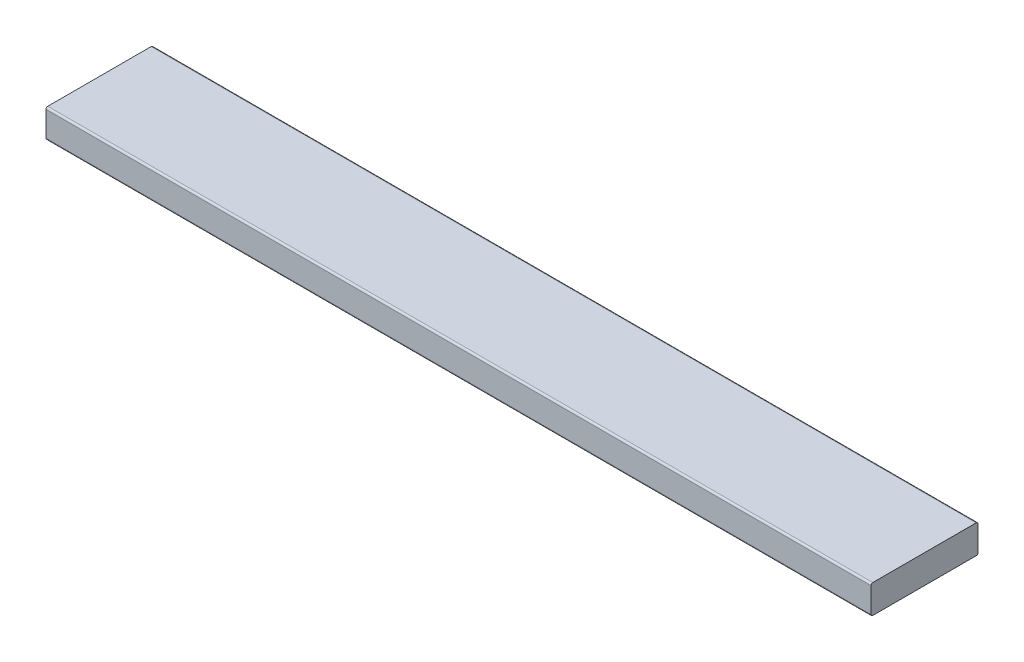
ISO-10303-21;
HEADER;
FILE_DESCRIPTION(('STEP AP214'),'2;1');
FILE_NAME('part.step','',(''),(''),'','','');
FILE_SCHEMA(('AUTOMOTIVE_DESIGN { 1 0 10303 214 1 1 1 1 }'));
ENDSEC;
DATA;
#1=APPLICATION_CONTEXT('core data for automotive mechanical design processes');
#2=APPLICATION_PROTOCOL_DEFINITION('international standard','automotive_design',2000,#1);
#3=PRODUCT_CONTEXT('',#1,'mechanical');
#4=PRODUCT('Part','Part','',(#3));
#5=PRODUCT_RELATED_PRODUCT_CATEGORY('part','',(#4));
#6=PRODUCT_DEFINITION_FORMATION('','',#4);
#7=PRODUCT_DEFINITION_CONTEXT('part definition',#1,'design');
#8=PRODUCT_DEFINITION('design','',#6,#7);
#9=PRODUCT_DEFINITION_SHAPE('','',#8);
#10=(LENGTH_UNIT() NAMED_UNIT(*) SI_UNIT(.MILLI.,.METRE.));
#11=(NAMED_UNIT(*) PLANE_ANGLE_UNIT() SI_UNIT($,.RADIAN.));
#12=(NAMED_UNIT(*) SI_UNIT($,.STERADIAN.) SOLID_ANGLE_UNIT());
#13=UNCERTAINTY_MEASURE_WITH_UNIT(LENGTH_MEASURE(1.E-05),#10,'distance_accuracy_value','');
#14=(GEOMETRIC_REPRESENTATION_CONTEXT(3) GLOBAL_UNCERTAINTY_ASSIGNED_CONTEXT((#13)) GLOBAL_UNIT_ASSIGNED_CONTEXT((#10,
#11,#12)) REPRESENTATION_CONTEXT('',''));
#15=CARTESIAN_POINT('',(0.,0.,0.));
#16=DIRECTION('',(0.,0.,1.));
#17=DIRECTION('',(1.,0.,0.));
#18=AXIS2_PLACEMENT_3D('',#15,#16,#17);
#19=CARTESIAN_POINT('',(462.5,-16.,-60.));
#20=DIRECTION('',(0.,0.,1.));
#21=DIRECTION('',(1.,0.,0.));
#22=AXIS2_PLACEMENT_3D('',#19,#20,#21);
#23=PLANE('',#22);
#24=DIRECTION('',(0.,1.,0.));
#25=VECTOR('',#24,1.);
#26=CARTESIAN_POINT('',(462.5,-16.,-60.));
#27=LINE('',#26,#25);
#28=CARTESIAN_POINT('',(462.5,-14.,-60.));
#29=VERTEX_POINT('',#28);
#30=CARTESIAN_POINT('',(462.5,14.,-60.));
#31=VERTEX_POINT('',#30);
#32=EDGE_CURVE('E121',#29,#31,#27,.T.);
#33=ORIENTED_EDGE('',*,*,#32,.F.);
#34=DIRECTION('',(-1.,0.,0.));
#35=VECTOR('',#34,1.);
#36=CARTESIAN_POINT('',(462.5,-14.,-60.));
#37=LINE('',#36,#35);
#38=CARTESIAN_POINT('',(-462.5,-14.,-60.));
#39=VERTEX_POINT('',#38);
#40=EDGE_CURVE('E106',#29,#39,#37,.T.);
#41=ORIENTED_EDGE('',*,*,#40,.T.);
#42=DIRECTION('',(0.,1.,0.));
#43=VECTOR('',#42,1.);
#44=CARTESIAN_POINT('',(-462.5,-16.,-60.));
#45=LINE('',#44,#43);
#46=CARTESIAN_POINT('',(-462.5,14.,-60.));
#47=VERTEX_POINT('',#46);
#48=EDGE_CURVE('E118',#39,#47,#45,.T.);
#49=ORIENTED_EDGE('',*,*,#48,.T.);
#50=DIRECTION('',(-1.,0.,0.));
#51=VECTOR('',#50,1.);
#52=CARTESIAN_POINT('',(462.5,14.,-60.));
#53=LINE('',#52,#51);
#54=EDGE_CURVE('E123',#47,#31,#53,.F.);
#55=ORIENTED_EDGE('',*,*,#54,.T.);
#56=EDGE_LOOP('',(#33,#41,#49,#55));
#57=FACE_BOUND('',#56,.T.);
#58=ADVANCED_FACE('F37',(#57),#23,.F.);
#59=CARTESIAN_POINT('',(462.5,16.,60.));
#60=DIRECTION('',(0.,-1.,0.));
#61=DIRECTION('',(0.,0.,-1.));
#62=AXIS2_PLACEMENT_3D('',#59,#60,#61);
#63=PLANE('',#62);
#64=DIRECTION('',(0.,0.,1.));
#65=VECTOR('',#64,1.);
#66=CARTESIAN_POINT('',(462.5,16.,60.));
#67=LINE('',#66,#65);
#68=CARTESIAN_POINT('',(462.5,16.,-58.));
#69=VERTEX_POINT('',#68);
#70=CARTESIAN_POINT('',(462.5,16.,58.));
#71=VERTEX_POINT('',#70);
#72=EDGE_CURVE('E172',#69,#71,#67,.T.);
#73=ORIENTED_EDGE('',*,*,#72,.F.);
#74=DIRECTION('',(-1.,0.,0.));
#75=VECTOR('',#74,1.);
#76=CARTESIAN_POINT('',(462.5,16.,-58.));
#77=LINE('',#76,#75);
#78=CARTESIAN_POINT('',(-462.5,16.,-58.));
#79=VERTEX_POINT('',#78);
#80=EDGE_CURVE('E156',#69,#79,#77,.T.);
#81=ORIENTED_EDGE('',*,*,#80,.T.);
#82=DIRECTION('',(0.,0.,1.));
#83=VECTOR('',#82,1.);
#84=CARTESIAN_POINT('',(-462.5,16.,60.));
#85=LINE('',#84,#83);
#86=CARTESIAN_POINT('',(-462.5,16.,58.));
#87=VERTEX_POINT('',#86);
#88=EDGE_CURVE('E127',#79,#87,#85,.T.);
#89=ORIENTED_EDGE('',*,*,#88,.T.);
#90=DIRECTION('',(-1.,0.,0.));
#91=VECTOR('',#90,1.);
#92=CARTESIAN_POINT('',(462.5,16.,58.));
#93=LINE('',#92,#91);
#94=EDGE_CURVE('E154',#87,#71,#93,.F.);
#95=ORIENTED_EDGE('',*,*,#94,.T.);
#96=EDGE_LOOP('',(#73,#81,#89,#95));
#97=FACE_BOUND('',#96,.T.);
#98=ADVANCED_FACE('F182',(#97),#63,.F.);
#99=CARTESIAN_POINT('',(462.5,-16.,60.));
#100=DIRECTION('',(0.,0.,-1.));
#101=DIRECTION('',(-1.,0.,0.));
#102=AXIS2_PLACEMENT_3D('',#99,#100,#101);
#103=PLANE('',#102);
#104=DIRECTION('',(0.,-1.,0.));
#105=VECTOR('',#104,1.);
#106=CARTESIAN_POINT('',(-462.5,-16.,60.));
#107=LINE('',#106,#105);
#108=CARTESIAN_POINT('',(-462.5,14.,60.));
#109=VERTEX_POINT('',#108);
#110=CARTESIAN_POINT('',(-462.5,-14.,60.));
#111=VERTEX_POINT('',#110);
#112=EDGE_CURVE('E130',#109,#111,#107,.T.);
#113=ORIENTED_EDGE('',*,*,#112,.T.);
#114=DIRECTION('',(-1.,0.,0.));
#115=VECTOR('',#114,1.);
#116=CARTESIAN_POINT('',(462.5,-14.,60.));
#117=LINE('',#116,#115);
#118=CARTESIAN_POINT('',(462.5,-14.,60.));
#119=VERTEX_POINT('',#118);
#120=EDGE_CURVE('E11',#111,#119,#117,.F.);
#121=ORIENTED_EDGE('',*,*,#120,.T.);
#122=DIRECTION('',(0.,-1.,0.));
#123=VECTOR('',#122,1.);
#124=CARTESIAN_POINT('',(462.5,-16.,60.));
#125=LINE('',#124,#123);
#126=CARTESIAN_POINT('',(462.5,14.,60.));
#127=VERTEX_POINT('',#126);
#128=EDGE_CURVE('E162',#127,#119,#125,.T.);
#129=ORIENTED_EDGE('',*,*,#128,.F.);
#130=DIRECTION('',(-1.,0.,0.));
#131=VECTOR('',#130,1.);
#132=CARTESIAN_POINT('',(462.5,14.,60.));
#133=LINE('',#132,#131);
#134=EDGE_CURVE('E45',#127,#109,#133,.T.);
#135=ORIENTED_EDGE('',*,*,#134,.T.);
#136=EDGE_LOOP('',(#113,#121,#129,#135));
#137=FACE_BOUND('',#136,.T.);
#138=ADVANCED_FACE('F161',(#137),#103,.F.);
#139=CARTESIAN_POINT('',(462.5,-16.,60.));
#140=DIRECTION('',(0.,1.,0.));
#141=DIRECTION('',(0.,0.,1.));
#142=AXIS2_PLACEMENT_3D('',#139,#140,#141);
#143=PLANE('',#142);
#144=DIRECTION('',(0.,0.,-1.));
#145=VECTOR('',#144,1.);
#146=CARTESIAN_POINT('',(-462.5,-16.,60.));
#147=LINE('',#146,#145);
#148=CARTESIAN_POINT('',(-462.5,-16.,58.));
#149=VERTEX_POINT('',#148);
#150=CARTESIAN_POINT('',(-462.5,-16.,-58.));
#151=VERTEX_POINT('',#150);
#152=EDGE_CURVE('E137',#149,#151,#147,.T.);
#153=ORIENTED_EDGE('',*,*,#152,.T.);
#154=DIRECTION('',(-1.,0.,0.));
#155=VECTOR('',#154,1.);
#156=CARTESIAN_POINT('',(462.5,-16.,-58.));
#157=LINE('',#156,#155);
#158=CARTESIAN_POINT('',(462.5,-16.,-58.));
#159=VERTEX_POINT('',#158);
#160=EDGE_CURVE('E107',#151,#159,#157,.F.);
#161=ORIENTED_EDGE('',*,*,#160,.T.);
#162=DIRECTION('',(0.,0.,-1.));
#163=VECTOR('',#162,1.);
#164=CARTESIAN_POINT('',(462.5,-16.,60.));
#165=LINE('',#164,#163);
#166=CARTESIAN_POINT('',(462.5,-16.,58.));
#167=VERTEX_POINT('',#166);
#168=EDGE_CURVE('E133',#167,#159,#165,.T.);
#169=ORIENTED_EDGE('',*,*,#168,.F.);
#170=DIRECTION('',(-1.,0.,0.));
#171=VECTOR('',#170,1.);
#172=CARTESIAN_POINT('',(462.5,-16.,58.));
#173=LINE('',#172,#171);
#174=EDGE_CURVE('E112',#167,#149,#173,.T.);
#175=ORIENTED_EDGE('',*,*,#174,.T.);
#176=EDGE_LOOP('',(#153,#161,#169,#175));
#177=FACE_BOUND('',#176,.T.);
#178=ADVANCED_FACE('F170',(#177),#143,.F.);
#179=CARTESIAN_POINT('',(462.5,0.,0.));
#180=DIRECTION('',(-1.,0.,0.));
#181=DIRECTION('',(0.,0.,1.));
#182=AXIS2_PLACEMENT_3D('',#179,#180,#181);
#183=PLANE('',#182);
#184=ORIENTED_EDGE('',*,*,#168,.T.);
#185=CARTESIAN_POINT('',(462.5,-14.,-58.));
#186=DIRECTION('',(-1.,0.,0.));
#187=DIRECTION('',(0.,0.,1.));
#188=AXIS2_PLACEMENT_3D('',#185,#186,#187);
#189=CIRCLE('',#188,2.);
#190=EDGE_CURVE('E152',#159,#29,#189,.F.);
#191=ORIENTED_EDGE('',*,*,#190,.T.);
#192=ORIENTED_EDGE('',*,*,#32,.T.);
#193=CARTESIAN_POINT('',(462.5,14.,-58.));
#194=DIRECTION('',(-1.,0.,0.));
#195=DIRECTION('',(0.,0.,1.));
#196=AXIS2_PLACEMENT_3D('',#193,#194,#195);
#197=CIRCLE('',#196,2.);
#198=EDGE_CURVE('E150',#31,#69,#197,.F.);
#199=ORIENTED_EDGE('',*,*,#198,.T.);
#200=ORIENTED_EDGE('',*,*,#72,.T.);
#201=CARTESIAN_POINT('',(462.5,14.,58.));
#202=DIRECTION('',(-1.,0.,0.));
#203=DIRECTION('',(0.,0.,1.));
#204=AXIS2_PLACEMENT_3D('',#201,#202,#203);
#205=CIRCLE('',#204,2.);
#206=EDGE_CURVE('E57',#71,#127,#205,.F.);
#207=ORIENTED_EDGE('',*,*,#206,.T.);
#208=ORIENTED_EDGE('',*,*,#128,.T.);
#209=CARTESIAN_POINT('',(462.5,-14.,58.));
#210=DIRECTION('',(-1.,0.,0.));
#211=DIRECTION('',(0.,0.,1.));
#212=AXIS2_PLACEMENT_3D('',#209,#210,#211);
#213=CIRCLE('',#212,2.);
#214=EDGE_CURVE('E148',#119,#167,#213,.F.);
#215=ORIENTED_EDGE('',*,*,#214,.T.);
#216=EDGE_LOOP('',(#184,#191,#192,#199,#200,#207,#208,#215));
#217=FACE_BOUND('',#216,.T.);
#218=ADVANCED_FACE('F176',(#217),#183,.F.);
#219=CARTESIAN_POINT('',(-462.5,0.,0.));
#220=DIRECTION('',(-1.,0.,0.));
#221=DIRECTION('',(0.,0.,1.));
#222=AXIS2_PLACEMENT_3D('',#219,#220,#221);
#223=PLANE('',#222);
#224=ORIENTED_EDGE('',*,*,#48,.F.);
#225=CARTESIAN_POINT('',(-462.5,-14.,-58.));
#226=DIRECTION('',(-1.,0.,0.));
#227=DIRECTION('',(0.,0.,1.));
#228=AXIS2_PLACEMENT_3D('',#225,#226,#227);
#229=CIRCLE('',#228,2.);
#230=EDGE_CURVE('E102',#39,#151,#229,.T.);
#231=ORIENTED_EDGE('',*,*,#230,.T.);
#232=ORIENTED_EDGE('',*,*,#152,.F.);
#233=CARTESIAN_POINT('',(-462.5,-14.,58.));
#234=DIRECTION('',(-1.,0.,0.));
#235=DIRECTION('',(0.,0.,1.));
#236=AXIS2_PLACEMENT_3D('',#233,#234,#235);
#237=CIRCLE('',#236,2.);
#238=EDGE_CURVE('E141',#149,#111,#237,.T.);
#239=ORIENTED_EDGE('',*,*,#238,.T.);
#240=ORIENTED_EDGE('',*,*,#112,.F.);
#241=CARTESIAN_POINT('',(-462.5,14.,58.));
#242=DIRECTION('',(-1.,0.,0.));
#243=DIRECTION('',(0.,0.,1.));
#244=AXIS2_PLACEMENT_3D('',#241,#242,#243);
#245=CIRCLE('',#244,2.);
#246=EDGE_CURVE('E122',#109,#87,#245,.T.);
#247=ORIENTED_EDGE('',*,*,#246,.T.);
#248=ORIENTED_EDGE('',*,*,#88,.F.);
#249=CARTESIAN_POINT('',(-462.5,14.,-58.));
#250=DIRECTION('',(-1.,0.,0.));
#251=DIRECTION('',(0.,0.,1.));
#252=AXIS2_PLACEMENT_3D('',#249,#250,#251);
#253=CIRCLE('',#252,2.);
#254=EDGE_CURVE('E113',#79,#47,#253,.T.);
#255=ORIENTED_EDGE('',*,*,#254,.T.);
#256=EDGE_LOOP('',(#224,#231,#232,#239,#240,#247,#248,#255));
#257=FACE_BOUND('',#256,.T.);
#258=ADVANCED_FACE('F125',(#257),#223,.T.);
#259=CARTESIAN_POINT('',(462.5,-14.,-58.));
#260=DIRECTION('',(-1.,0.,0.));
#261=DIRECTION('',(0.,0.,1.));
#262=AXIS2_PLACEMENT_3D('',#259,#260,#261);
#263=CYLINDRICAL_SURFACE('',#262,2.);
#264=ORIENTED_EDGE('',*,*,#190,.F.);
#265=ORIENTED_EDGE('',*,*,#160,.F.);
#266=ORIENTED_EDGE('',*,*,#230,.F.);
#267=ORIENTED_EDGE('',*,*,#40,.F.);
#268=EDGE_LOOP('',(#264,#265,#266,#267));
#269=FACE_BOUND('',#268,.T.);
#270=ADVANCED_FACE('F105',(#269),#263,.T.);
#271=CARTESIAN_POINT('',(462.5,14.,-58.));
#272=DIRECTION('',(-1.,0.,0.));
#273=DIRECTION('',(0.,0.,1.));
#274=AXIS2_PLACEMENT_3D('',#271,#272,#273);
#275=CYLINDRICAL_SURFACE('',#274,2.);
#276=ORIENTED_EDGE('',*,*,#198,.F.);
#277=ORIENTED_EDGE('',*,*,#54,.F.);
#278=ORIENTED_EDGE('',*,*,#254,.F.);
#279=ORIENTED_EDGE('',*,*,#80,.F.);
#280=EDGE_LOOP('',(#276,#277,#278,#279));
#281=FACE_BOUND('',#280,.T.);
#282=ADVANCED_FACE('F180',(#281),#275,.T.);
#283=CARTESIAN_POINT('',(462.5,-14.,58.));
#284=DIRECTION('',(-1.,0.,0.));
#285=DIRECTION('',(0.,0.,1.));
#286=AXIS2_PLACEMENT_3D('',#283,#284,#285);
#287=CYLINDRICAL_SURFACE('',#286,2.);
#288=ORIENTED_EDGE('',*,*,#214,.F.);
#289=ORIENTED_EDGE('',*,*,#120,.F.);
#290=ORIENTED_EDGE('',*,*,#238,.F.);
#291=ORIENTED_EDGE('',*,*,#174,.F.);
#292=EDGE_LOOP('',(#288,#289,#290,#291));
#293=FACE_BOUND('',#292,.T.);
#294=ADVANCED_FACE('F167',(#293),#287,.T.);
#295=CARTESIAN_POINT('',(462.5,14.,58.));
#296=DIRECTION('',(-1.,0.,0.));
#297=DIRECTION('',(0.,0.,1.));
#298=AXIS2_PLACEMENT_3D('',#295,#296,#297);
#299=CYLINDRICAL_SURFACE('',#298,2.);
#300=ORIENTED_EDGE('',*,*,#206,.F.);
#301=ORIENTED_EDGE('',*,*,#94,.F.);
#302=ORIENTED_EDGE('',*,*,#246,.F.);
#303=ORIENTED_EDGE('',*,*,#134,.F.);
#304=EDGE_LOOP('',(#300,#301,#302,#303));
#305=FACE_BOUND('',#304,.T.);
#306=ADVANCED_FACE('F39',(#305),#299,.T.);
#307=CLOSED_SHELL('',(#58,#98,#138,#178,#218,#258,#270,#282,#294,#306));
#308=MANIFOLD_SOLID_BREP('B2',#307);
#309=ADVANCED_BREP_SHAPE_REPRESENTATION('',(#18,#308),#14);
#310=SHAPE_DEFINITION_REPRESENTATION(#9,#309);
ENDSEC;
END-ISO-10303-21;
